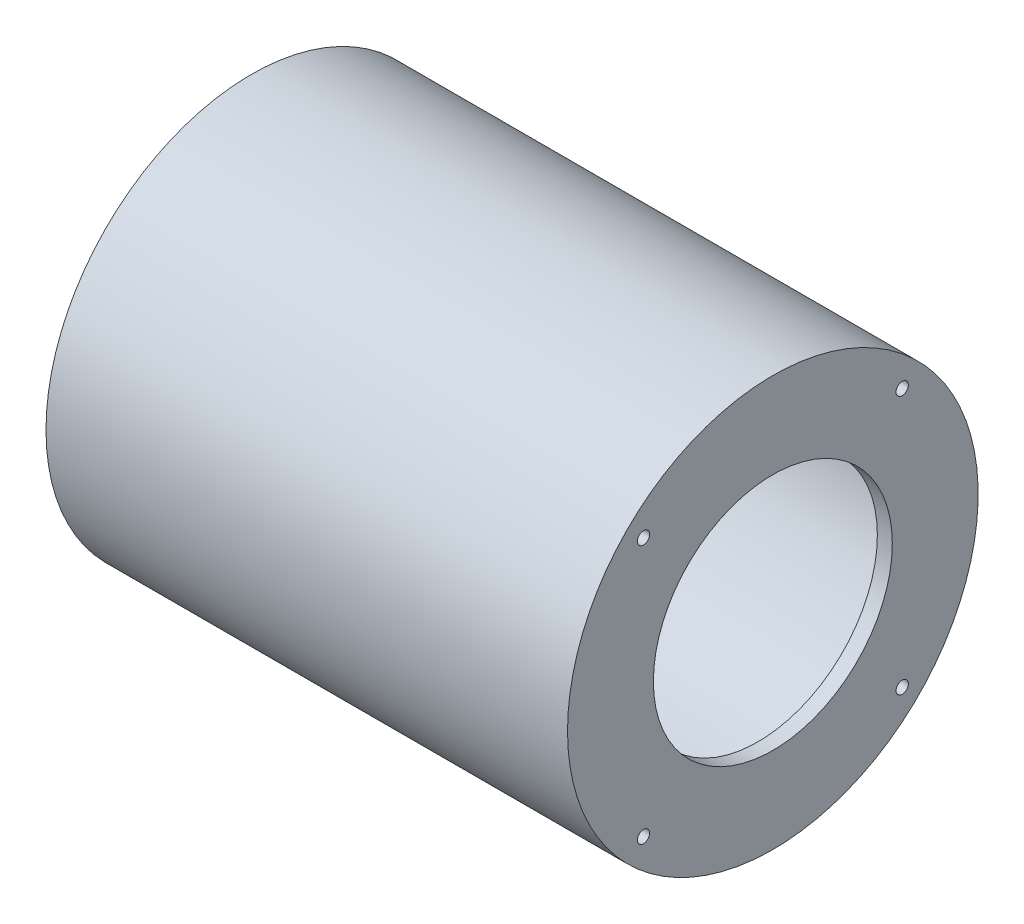
ISO-10303-21;
HEADER;
FILE_DESCRIPTION(('STEP AP214'),'2;1');
FILE_NAME('part.step','',(''),(''),'','','');
FILE_SCHEMA(('AUTOMOTIVE_DESIGN { 1 0 10303 214 1 1 1 1 }'));
ENDSEC;
DATA;
#1=APPLICATION_CONTEXT('core data for automotive mechanical design processes');
#2=APPLICATION_PROTOCOL_DEFINITION('international standard','automotive_design',2000,#1);
#3=PRODUCT_CONTEXT('',#1,'mechanical');
#4=PRODUCT('Part','Part','',(#3));
#5=PRODUCT_RELATED_PRODUCT_CATEGORY('part','',(#4));
#6=PRODUCT_DEFINITION_FORMATION('','',#4);
#7=PRODUCT_DEFINITION_CONTEXT('part definition',#1,'design');
#8=PRODUCT_DEFINITION('design','',#6,#7);
#9=PRODUCT_DEFINITION_SHAPE('','',#8);
#10=(LENGTH_UNIT() NAMED_UNIT(*) SI_UNIT(.MILLI.,.METRE.));
#11=(NAMED_UNIT(*) PLANE_ANGLE_UNIT() SI_UNIT($,.RADIAN.));
#12=(NAMED_UNIT(*) SI_UNIT($,.STERADIAN.) SOLID_ANGLE_UNIT());
#13=UNCERTAINTY_MEASURE_WITH_UNIT(LENGTH_MEASURE(1.E-05),#10,'distance_accuracy_value','');
#14=(GEOMETRIC_REPRESENTATION_CONTEXT(3) GLOBAL_UNCERTAINTY_ASSIGNED_CONTEXT((#13)) GLOBAL_UNIT_ASSIGNED_CONTEXT((#10,
#11,#12)) REPRESENTATION_CONTEXT('',''));
#15=CARTESIAN_POINT('',(0.,0.,0.));
#16=DIRECTION('',(0.,0.,1.));
#17=DIRECTION('',(1.,0.,0.));
#18=AXIS2_PLACEMENT_3D('',#15,#16,#17);
#19=CARTESIAN_POINT('',(-126.,55.,0.));
#20=DIRECTION('',(1.,0.,0.));
#21=DIRECTION('',(0.,0.,-1.));
#22=AXIS2_PLACEMENT_3D('',#19,#20,#21);
#23=PLANE('',#22);
#24=CARTESIAN_POINT('',(-126.,0.,0.));
#25=DIRECTION('',(-1.,0.,0.));
#26=DIRECTION('',(0.,0.,1.));
#27=AXIS2_PLACEMENT_3D('',#24,#25,#26);
#28=CIRCLE('',#27,52.);
#29=CARTESIAN_POINT('',(-126.,0.,52.));
#30=VERTEX_POINT('',#29);
#31=EDGE_CURVE('E10',#30,#30,#28,.T.);
#32=ORIENTED_EDGE('',*,*,#31,.F.);
#33=EDGE_LOOP('',(#32));
#34=FACE_BOUND('',#33,.T.);
#35=CARTESIAN_POINT('',(-126.,0.,0.));
#36=DIRECTION('',(-1.,0.,0.));
#37=DIRECTION('',(0.,0.,1.));
#38=AXIS2_PLACEMENT_3D('',#35,#36,#37);
#39=CIRCLE('',#38,55.);
#40=CARTESIAN_POINT('',(-126.,0.,55.));
#41=VERTEX_POINT('',#40);
#42=EDGE_CURVE('E53',#41,#41,#39,.T.);
#43=ORIENTED_EDGE('',*,*,#42,.T.);
#44=EDGE_LOOP('',(#43));
#45=FACE_BOUND('',#44,.T.);
#46=ADVANCED_FACE('F31',(#34,#45),#23,.F.);
#47=CARTESIAN_POINT('',(-110.,0.,0.));
#48=DIRECTION('',(-1.,0.,0.));
#49=DIRECTION('',(0.,0.,1.));
#50=AXIS2_PLACEMENT_3D('',#47,#48,#49);
#51=CYLINDRICAL_SURFACE('',#50,52.);
#52=CARTESIAN_POINT('',(9.7,0.,0.));
#53=DIRECTION('',(-1.,0.,0.));
#54=DIRECTION('',(0.,0.,1.));
#55=AXIS2_PLACEMENT_3D('',#52,#53,#54);
#56=CIRCLE('',#55,52.);
#57=CARTESIAN_POINT('',(9.7,0.,52.));
#58=VERTEX_POINT('',#57);
#59=EDGE_CURVE('E37',#58,#58,#56,.T.);
#60=ORIENTED_EDGE('',*,*,#59,.F.);
#61=EDGE_LOOP('',(#60));
#62=FACE_BOUND('',#61,.T.);
#63=ORIENTED_EDGE('',*,*,#31,.T.);
#64=EDGE_LOOP('',(#63));
#65=FACE_BOUND('',#64,.T.);
#66=ADVANCED_FACE('F104',(#62,#65),#51,.F.);
#67=CARTESIAN_POINT('',(9.7,52.,0.));
#68=DIRECTION('',(1.,0.,0.));
#69=DIRECTION('',(0.,0.,-1.));
#70=AXIS2_PLACEMENT_3D('',#67,#68,#69);
#71=PLANE('',#70);
#72=CARTESIAN_POINT('',(9.7,34.6482322781408,-34.6482322781408));
#73=DIRECTION('',(1.,0.,0.));
#74=DIRECTION('',(0.,0.,-1.));
#75=AXIS2_PLACEMENT_3D('',#72,#73,#74);
#76=CIRCLE('',#75,1.65);
#77=CARTESIAN_POINT('',(9.7,34.6482322781408,-36.2982322781408));
#78=VERTEX_POINT('',#77);
#79=EDGE_CURVE('E63',#78,#78,#76,.T.);
#80=ORIENTED_EDGE('',*,*,#79,.T.);
#81=EDGE_LOOP('',(#80));
#82=FACE_BOUND('',#81,.T.);
#83=CARTESIAN_POINT('',(9.7,-34.6482322781408,-34.6482322781408));
#84=DIRECTION('',(1.,0.,0.));
#85=DIRECTION('',(0.,0.,-1.));
#86=AXIS2_PLACEMENT_3D('',#83,#84,#85);
#87=CIRCLE('',#86,1.65);
#88=CARTESIAN_POINT('',(9.7,-34.6482322781408,-36.2982322781408));
#89=VERTEX_POINT('',#88);
#90=EDGE_CURVE('E69',#89,#89,#87,.T.);
#91=ORIENTED_EDGE('',*,*,#90,.T.);
#92=EDGE_LOOP('',(#91));
#93=FACE_BOUND('',#92,.T.);
#94=CARTESIAN_POINT('',(9.7,-34.6482322781408,34.6482322781408));
#95=DIRECTION('',(1.,0.,0.));
#96=DIRECTION('',(0.,0.,-1.));
#97=AXIS2_PLACEMENT_3D('',#94,#95,#96);
#98=CIRCLE('',#97,1.65);
#99=CARTESIAN_POINT('',(9.7,-34.6482322781408,32.9982322781408));
#100=VERTEX_POINT('',#99);
#101=EDGE_CURVE('E75',#100,#100,#98,.T.);
#102=ORIENTED_EDGE('',*,*,#101,.T.);
#103=EDGE_LOOP('',(#102));
#104=FACE_BOUND('',#103,.T.);
#105=CARTESIAN_POINT('',(9.7,34.6482322781408,34.6482322781408));
#106=DIRECTION('',(1.,0.,0.));
#107=DIRECTION('',(0.,0.,-1.));
#108=AXIS2_PLACEMENT_3D('',#105,#106,#107);
#109=CIRCLE('',#108,1.65);
#110=CARTESIAN_POINT('',(9.7,34.6482322781408,32.9982322781408));
#111=VERTEX_POINT('',#110);
#112=EDGE_CURVE('E57',#111,#111,#109,.T.);
#113=ORIENTED_EDGE('',*,*,#112,.T.);
#114=EDGE_LOOP('',(#113));
#115=FACE_BOUND('',#114,.T.);
#116=CARTESIAN_POINT('',(9.7,0.,0.));
#117=DIRECTION('',(-1.,0.,0.));
#118=DIRECTION('',(0.,0.,1.));
#119=AXIS2_PLACEMENT_3D('',#116,#117,#118);
#120=CIRCLE('',#119,32.);
#121=CARTESIAN_POINT('',(9.7,0.,32.));
#122=VERTEX_POINT('',#121);
#123=EDGE_CURVE('E41',#122,#122,#120,.T.);
#124=ORIENTED_EDGE('',*,*,#123,.F.);
#125=EDGE_LOOP('',(#124));
#126=FACE_BOUND('',#125,.T.);
#127=ORIENTED_EDGE('',*,*,#59,.T.);
#128=EDGE_LOOP('',(#127));
#129=FACE_BOUND('',#128,.T.);
#130=ADVANCED_FACE('F99',(#82,#93,#104,#115,#126,#129),#71,.F.);
#131=CARTESIAN_POINT('',(-110.,0.,0.));
#132=DIRECTION('',(-1.,0.,0.));
#133=DIRECTION('',(0.,0.,1.));
#134=AXIS2_PLACEMENT_3D('',#131,#132,#133);
#135=CYLINDRICAL_SURFACE('',#134,32.);
#136=CARTESIAN_POINT('',(13.7,0.,0.));
#137=DIRECTION('',(-1.,0.,0.));
#138=DIRECTION('',(0.,0.,1.));
#139=AXIS2_PLACEMENT_3D('',#136,#137,#138);
#140=CIRCLE('',#139,32.);
#141=CARTESIAN_POINT('',(13.7,0.,32.));
#142=VERTEX_POINT('',#141);
#143=EDGE_CURVE('E45',#142,#142,#140,.T.);
#144=ORIENTED_EDGE('',*,*,#143,.F.);
#145=EDGE_LOOP('',(#144));
#146=FACE_BOUND('',#145,.T.);
#147=ORIENTED_EDGE('',*,*,#123,.T.);
#148=EDGE_LOOP('',(#147));
#149=FACE_BOUND('',#148,.T.);
#150=ADVANCED_FACE('F88',(#146,#149),#135,.F.);
#151=CARTESIAN_POINT('',(13.7,32.,0.));
#152=DIRECTION('',(-1.,0.,0.));
#153=DIRECTION('',(0.,0.,1.));
#154=AXIS2_PLACEMENT_3D('',#151,#152,#153);
#155=PLANE('',#154);
#156=CARTESIAN_POINT('',(13.7,34.6482322781408,-34.6482322781408));
#157=DIRECTION('',(1.,0.,0.));
#158=DIRECTION('',(0.,0.,-1.));
#159=AXIS2_PLACEMENT_3D('',#156,#157,#158);
#160=CIRCLE('',#159,1.65);
#161=CARTESIAN_POINT('',(13.7,34.6482322781408,-36.2982322781408));
#162=VERTEX_POINT('',#161);
#163=EDGE_CURVE('E66',#162,#162,#160,.T.);
#164=ORIENTED_EDGE('',*,*,#163,.F.);
#165=EDGE_LOOP('',(#164));
#166=FACE_BOUND('',#165,.T.);
#167=CARTESIAN_POINT('',(13.7,-34.6482322781408,-34.6482322781408));
#168=DIRECTION('',(1.,0.,0.));
#169=DIRECTION('',(0.,0.,-1.));
#170=AXIS2_PLACEMENT_3D('',#167,#168,#169);
#171=CIRCLE('',#170,1.65);
#172=CARTESIAN_POINT('',(13.7,-34.6482322781408,-36.2982322781408));
#173=VERTEX_POINT('',#172);
#174=EDGE_CURVE('E72',#173,#173,#171,.T.);
#175=ORIENTED_EDGE('',*,*,#174,.F.);
#176=EDGE_LOOP('',(#175));
#177=FACE_BOUND('',#176,.T.);
#178=CARTESIAN_POINT('',(13.7,-34.6482322781408,34.6482322781408));
#179=DIRECTION('',(1.,0.,0.));
#180=DIRECTION('',(0.,0.,-1.));
#181=AXIS2_PLACEMENT_3D('',#178,#179,#180);
#182=CIRCLE('',#181,1.65);
#183=CARTESIAN_POINT('',(13.7,-34.6482322781408,32.9982322781408));
#184=VERTEX_POINT('',#183);
#185=EDGE_CURVE('E60',#184,#184,#182,.T.);
#186=ORIENTED_EDGE('',*,*,#185,.F.);
#187=EDGE_LOOP('',(#186));
#188=FACE_BOUND('',#187,.T.);
#189=CARTESIAN_POINT('',(13.7,34.6482322781408,34.6482322781408));
#190=DIRECTION('',(1.,0.,0.));
#191=DIRECTION('',(0.,0.,-1.));
#192=AXIS2_PLACEMENT_3D('',#189,#190,#191);
#193=CIRCLE('',#192,1.65);
#194=CARTESIAN_POINT('',(13.7,34.6482322781408,32.9982322781408));
#195=VERTEX_POINT('',#194);
#196=EDGE_CURVE('E56',#195,#195,#193,.T.);
#197=ORIENTED_EDGE('',*,*,#196,.F.);
#198=EDGE_LOOP('',(#197));
#199=FACE_BOUND('',#198,.T.);
#200=CARTESIAN_POINT('',(13.7,0.,0.));
#201=DIRECTION('',(-1.,0.,0.));
#202=DIRECTION('',(0.,0.,1.));
#203=AXIS2_PLACEMENT_3D('',#200,#201,#202);
#204=CIRCLE('',#203,55.);
#205=CARTESIAN_POINT('',(13.7,0.,55.));
#206=VERTEX_POINT('',#205);
#207=EDGE_CURVE('E50',#206,#206,#204,.T.);
#208=ORIENTED_EDGE('',*,*,#207,.F.);
#209=EDGE_LOOP('',(#208));
#210=FACE_BOUND('',#209,.T.);
#211=ORIENTED_EDGE('',*,*,#143,.T.);
#212=EDGE_LOOP('',(#211));
#213=FACE_BOUND('',#212,.T.);
#214=ADVANCED_FACE('F84',(#166,#177,#188,#199,#210,#213),#155,.F.);
#215=CARTESIAN_POINT('',(-110.,0.,0.));
#216=DIRECTION('',(-1.,0.,0.));
#217=DIRECTION('',(0.,0.,1.));
#218=AXIS2_PLACEMENT_3D('',#215,#216,#217);
#219=CYLINDRICAL_SURFACE('',#218,55.);
#220=ORIENTED_EDGE('',*,*,#42,.F.);
#221=EDGE_LOOP('',(#220));
#222=FACE_BOUND('',#221,.T.);
#223=ORIENTED_EDGE('',*,*,#207,.T.);
#224=EDGE_LOOP('',(#223));
#225=FACE_BOUND('',#224,.T.);
#226=ADVANCED_FACE('F87',(#222,#225),#219,.T.);
#227=CARTESIAN_POINT('',(13.7,34.6482322781408,34.6482322781408));
#228=DIRECTION('',(-1.,0.,0.));
#229=DIRECTION('',(0.,0.,1.));
#230=AXIS2_PLACEMENT_3D('',#227,#228,#229);
#231=CYLINDRICAL_SURFACE('',#230,1.65);
#232=ORIENTED_EDGE('',*,*,#196,.T.);
#233=EDGE_LOOP('',(#232));
#234=FACE_BOUND('',#233,.T.);
#235=ORIENTED_EDGE('',*,*,#112,.F.);
#236=EDGE_LOOP('',(#235));
#237=FACE_BOUND('',#236,.T.);
#238=ADVANCED_FACE('F121',(#234,#237),#231,.F.);
#239=CARTESIAN_POINT('',(13.7,-34.6482322781408,34.6482322781408));
#240=DIRECTION('',(-1.,0.,0.));
#241=DIRECTION('',(0.,0.,1.));
#242=AXIS2_PLACEMENT_3D('',#239,#240,#241);
#243=CYLINDRICAL_SURFACE('',#242,1.65);
#244=ORIENTED_EDGE('',*,*,#185,.T.);
#245=EDGE_LOOP('',(#244));
#246=FACE_BOUND('',#245,.T.);
#247=ORIENTED_EDGE('',*,*,#101,.F.);
#248=EDGE_LOOP('',(#247));
#249=FACE_BOUND('',#248,.T.);
#250=ADVANCED_FACE('F81',(#246,#249),#243,.F.);
#251=CARTESIAN_POINT('',(13.7,-34.6482322781408,-34.6482322781408));
#252=DIRECTION('',(-1.,0.,0.));
#253=DIRECTION('',(0.,0.,1.));
#254=AXIS2_PLACEMENT_3D('',#251,#252,#253);
#255=CYLINDRICAL_SURFACE('',#254,1.65);
#256=ORIENTED_EDGE('',*,*,#174,.T.);
#257=EDGE_LOOP('',(#256));
#258=FACE_BOUND('',#257,.T.);
#259=ORIENTED_EDGE('',*,*,#90,.F.);
#260=EDGE_LOOP('',(#259));
#261=FACE_BOUND('',#260,.T.);
#262=ADVANCED_FACE('F132',(#258,#261),#255,.F.);
#263=CARTESIAN_POINT('',(13.7,34.6482322781408,-34.6482322781408));
#264=DIRECTION('',(-1.,0.,0.));
#265=DIRECTION('',(0.,0.,1.));
#266=AXIS2_PLACEMENT_3D('',#263,#264,#265);
#267=CYLINDRICAL_SURFACE('',#266,1.65);
#268=ORIENTED_EDGE('',*,*,#163,.T.);
#269=EDGE_LOOP('',(#268));
#270=FACE_BOUND('',#269,.T.);
#271=ORIENTED_EDGE('',*,*,#79,.F.);
#272=EDGE_LOOP('',(#271));
#273=FACE_BOUND('',#272,.T.);
#274=ADVANCED_FACE('F129',(#270,#273),#267,.F.);
#275=CLOSED_SHELL('',(#46,#66,#130,#150,#214,#226,#238,#250,#262,#274));
#276=MANIFOLD_SOLID_BREP('B2',#275);
#277=ADVANCED_BREP_SHAPE_REPRESENTATION('',(#18,#276),#14);
#278=SHAPE_DEFINITION_REPRESENTATION(#9,#277);
ENDSEC;
END-ISO-10303-21;
